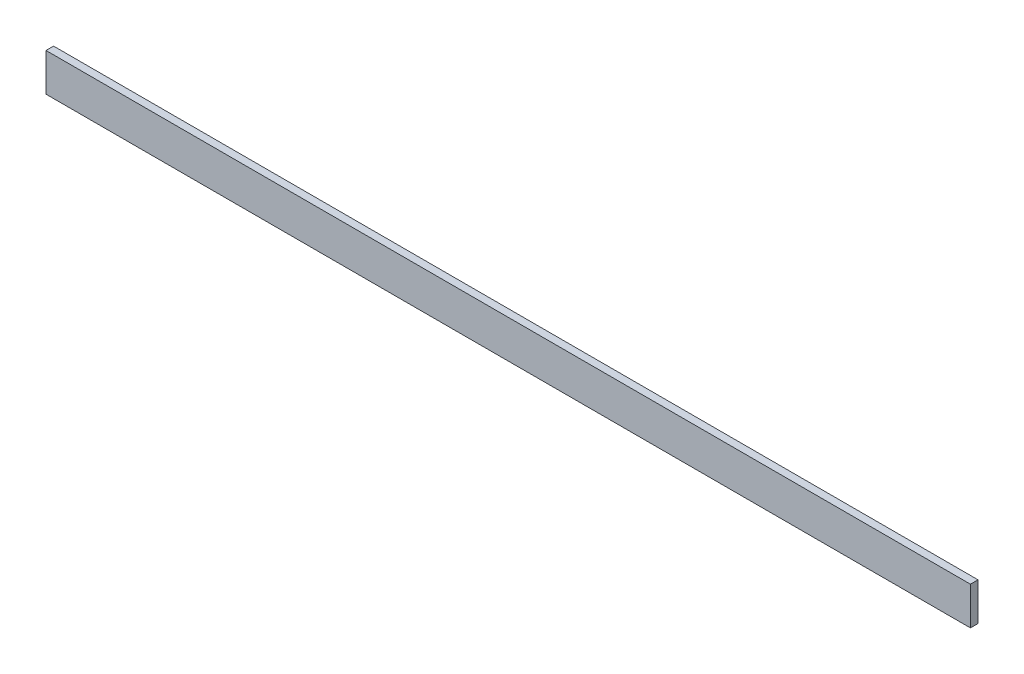
ISO-10303-21;
HEADER;
FILE_DESCRIPTION(('STEP AP214'),'2;1');
FILE_NAME('part.step','',(''),(''),'','','');
FILE_SCHEMA(('AUTOMOTIVE_DESIGN { 1 0 10303 214 1 1 1 1 }'));
ENDSEC;
DATA;
#1=APPLICATION_CONTEXT('core data for automotive mechanical design processes');
#2=APPLICATION_PROTOCOL_DEFINITION('international standard','automotive_design',2000,#1);
#3=PRODUCT_CONTEXT('',#1,'mechanical');
#4=PRODUCT('Part','Part','',(#3));
#5=PRODUCT_RELATED_PRODUCT_CATEGORY('part','',(#4));
#6=PRODUCT_DEFINITION_FORMATION('','',#4);
#7=PRODUCT_DEFINITION_CONTEXT('part definition',#1,'design');
#8=PRODUCT_DEFINITION('design','',#6,#7);
#9=PRODUCT_DEFINITION_SHAPE('','',#8);
#10=(LENGTH_UNIT() NAMED_UNIT(*) SI_UNIT(.MILLI.,.METRE.));
#11=(NAMED_UNIT(*) PLANE_ANGLE_UNIT() SI_UNIT($,.RADIAN.));
#12=(NAMED_UNIT(*) SI_UNIT($,.STERADIAN.) SOLID_ANGLE_UNIT());
#13=UNCERTAINTY_MEASURE_WITH_UNIT(LENGTH_MEASURE(1.E-05),#10,'distance_accuracy_value','');
#14=(GEOMETRIC_REPRESENTATION_CONTEXT(3) GLOBAL_UNCERTAINTY_ASSIGNED_CONTEXT((#13)) GLOBAL_UNIT_ASSIGNED_CONTEXT((#10,
#11,#12)) REPRESENTATION_CONTEXT('',''));
#15=CARTESIAN_POINT('',(0.,0.,0.));
#16=DIRECTION('',(0.,0.,1.));
#17=DIRECTION('',(1.,0.,0.));
#18=AXIS2_PLACEMENT_3D('',#15,#16,#17);
#19=CARTESIAN_POINT('',(-305.,12.5,5.));
#20=DIRECTION('',(1.,0.,0.));
#21=DIRECTION('',(0.,0.,-1.));
#22=AXIS2_PLACEMENT_3D('',#19,#20,#21);
#23=PLANE('',#22);
#24=DIRECTION('',(0.,-1.,0.));
#25=VECTOR('',#24,1.);
#26=CARTESIAN_POINT('',(-305.,12.5,0.));
#27=LINE('',#26,#25);
#28=CARTESIAN_POINT('',(-305.,12.5,0.));
#29=VERTEX_POINT('',#28);
#30=CARTESIAN_POINT('',(-305.,-12.5,0.));
#31=VERTEX_POINT('',#30);
#32=EDGE_CURVE('E96',#29,#31,#27,.T.);
#33=ORIENTED_EDGE('',*,*,#32,.T.);
#34=DIRECTION('',(0.,0.,-1.));
#35=VECTOR('',#34,1.);
#36=CARTESIAN_POINT('',(-305.,-12.5,5.));
#37=LINE('',#36,#35);
#38=CARTESIAN_POINT('',(-305.,-12.5,5.));
#39=VERTEX_POINT('',#38);
#40=EDGE_CURVE('E11',#39,#31,#37,.T.);
#41=ORIENTED_EDGE('',*,*,#40,.F.);
#42=DIRECTION('',(0.,-1.,0.));
#43=VECTOR('',#42,1.);
#44=CARTESIAN_POINT('',(-305.,12.5,5.));
#45=LINE('',#44,#43);
#46=CARTESIAN_POINT('',(-305.,12.5,5.));
#47=VERTEX_POINT('',#46);
#48=EDGE_CURVE('E84',#47,#39,#45,.T.);
#49=ORIENTED_EDGE('',*,*,#48,.F.);
#50=DIRECTION('',(0.,0.,-1.));
#51=VECTOR('',#50,1.);
#52=CARTESIAN_POINT('',(-305.,12.5,5.));
#53=LINE('',#52,#51);
#54=EDGE_CURVE('E92',#47,#29,#53,.T.);
#55=ORIENTED_EDGE('',*,*,#54,.T.);
#56=EDGE_LOOP('',(#33,#41,#49,#55));
#57=FACE_BOUND('',#56,.T.);
#58=ADVANCED_FACE('F33',(#57),#23,.F.);
#59=CARTESIAN_POINT('',(305.,-12.5,5.));
#60=DIRECTION('',(0.,1.,0.));
#61=DIRECTION('',(-1.,0.,0.));
#62=AXIS2_PLACEMENT_3D('',#59,#60,#61);
#63=PLANE('',#62);
#64=DIRECTION('',(1.,0.,0.));
#65=VECTOR('',#64,1.);
#66=CARTESIAN_POINT('',(305.,-12.5,0.));
#67=LINE('',#66,#65);
#68=CARTESIAN_POINT('',(305.,-12.5,0.));
#69=VERTEX_POINT('',#68);
#70=EDGE_CURVE('E88',#31,#69,#67,.T.);
#71=ORIENTED_EDGE('',*,*,#70,.T.);
#72=DIRECTION('',(0.,0.,-1.));
#73=VECTOR('',#72,1.);
#74=CARTESIAN_POINT('',(305.,-12.5,5.));
#75=LINE('',#74,#73);
#76=CARTESIAN_POINT('',(305.,-12.5,5.));
#77=VERTEX_POINT('',#76);
#78=EDGE_CURVE('E41',#77,#69,#75,.T.);
#79=ORIENTED_EDGE('',*,*,#78,.F.);
#80=DIRECTION('',(1.,0.,0.));
#81=VECTOR('',#80,1.);
#82=CARTESIAN_POINT('',(305.,-12.5,5.));
#83=LINE('',#82,#81);
#84=EDGE_CURVE('E79',#39,#77,#83,.T.);
#85=ORIENTED_EDGE('',*,*,#84,.F.);
#86=ORIENTED_EDGE('',*,*,#40,.T.);
#87=EDGE_LOOP('',(#71,#79,#85,#86));
#88=FACE_BOUND('',#87,.T.);
#89=ADVANCED_FACE('F87',(#88),#63,.F.);
#90=CARTESIAN_POINT('',(305.,12.5,5.));
#91=DIRECTION('',(-1.,0.,0.));
#92=DIRECTION('',(0.,0.,1.));
#93=AXIS2_PLACEMENT_3D('',#90,#91,#92);
#94=PLANE('',#93);
#95=DIRECTION('',(0.,1.,0.));
#96=VECTOR('',#95,1.);
#97=CARTESIAN_POINT('',(305.,12.5,0.));
#98=LINE('',#97,#96);
#99=CARTESIAN_POINT('',(305.,12.5,0.));
#100=VERTEX_POINT('',#99);
#101=EDGE_CURVE('E66',#69,#100,#98,.T.);
#102=ORIENTED_EDGE('',*,*,#101,.T.);
#103=DIRECTION('',(0.,0.,-1.));
#104=VECTOR('',#103,1.);
#105=CARTESIAN_POINT('',(305.,12.5,5.));
#106=LINE('',#105,#104);
#107=CARTESIAN_POINT('',(305.,12.5,5.));
#108=VERTEX_POINT('',#107);
#109=EDGE_CURVE('E89',#108,#100,#106,.T.);
#110=ORIENTED_EDGE('',*,*,#109,.F.);
#111=DIRECTION('',(0.,1.,0.));
#112=VECTOR('',#111,1.);
#113=CARTESIAN_POINT('',(305.,12.5,5.));
#114=LINE('',#113,#112);
#115=EDGE_CURVE('E82',#77,#108,#114,.T.);
#116=ORIENTED_EDGE('',*,*,#115,.F.);
#117=ORIENTED_EDGE('',*,*,#78,.T.);
#118=EDGE_LOOP('',(#102,#110,#116,#117));
#119=FACE_BOUND('',#118,.T.);
#120=ADVANCED_FACE('F90',(#119),#94,.F.);
#121=CARTESIAN_POINT('',(305.,12.5,5.));
#122=DIRECTION('',(0.,-1.,0.));
#123=DIRECTION('',(1.,0.,0.));
#124=AXIS2_PLACEMENT_3D('',#121,#122,#123);
#125=PLANE('',#124);
#126=DIRECTION('',(-1.,0.,0.));
#127=VECTOR('',#126,1.);
#128=CARTESIAN_POINT('',(305.,12.5,0.));
#129=LINE('',#128,#127);
#130=EDGE_CURVE('E72',#100,#29,#129,.T.);
#131=ORIENTED_EDGE('',*,*,#130,.T.);
#132=ORIENTED_EDGE('',*,*,#54,.F.);
#133=DIRECTION('',(-1.,0.,0.));
#134=VECTOR('',#133,1.);
#135=CARTESIAN_POINT('',(305.,12.5,5.));
#136=LINE('',#135,#134);
#137=EDGE_CURVE('E49',#108,#47,#136,.T.);
#138=ORIENTED_EDGE('',*,*,#137,.F.);
#139=ORIENTED_EDGE('',*,*,#109,.T.);
#140=EDGE_LOOP('',(#131,#132,#138,#139));
#141=FACE_BOUND('',#140,.T.);
#142=ADVANCED_FACE('F103',(#141),#125,.F.);
#143=CARTESIAN_POINT('',(0.,0.,5.));
#144=DIRECTION('',(0.,0.,-1.));
#145=DIRECTION('',(-1.,0.,0.));
#146=AXIS2_PLACEMENT_3D('',#143,#144,#145);
#147=PLANE('',#146);
#148=ORIENTED_EDGE('',*,*,#48,.T.);
#149=ORIENTED_EDGE('',*,*,#84,.T.);
#150=ORIENTED_EDGE('',*,*,#115,.T.);
#151=ORIENTED_EDGE('',*,*,#137,.T.);
#152=EDGE_LOOP('',(#148,#149,#150,#151));
#153=FACE_BOUND('',#152,.T.);
#154=ADVANCED_FACE('F80',(#153),#147,.F.);
#155=CARTESIAN_POINT('',(0.,0.,0.));
#156=DIRECTION('',(0.,0.,-1.));
#157=DIRECTION('',(-1.,0.,0.));
#158=AXIS2_PLACEMENT_3D('',#155,#156,#157);
#159=PLANE('',#158);
#160=ORIENTED_EDGE('',*,*,#32,.F.);
#161=ORIENTED_EDGE('',*,*,#130,.F.);
#162=ORIENTED_EDGE('',*,*,#101,.F.);
#163=ORIENTED_EDGE('',*,*,#70,.F.);
#164=EDGE_LOOP('',(#160,#161,#162,#163));
#165=FACE_BOUND('',#164,.T.);
#166=ADVANCED_FACE('F106',(#165),#159,.T.);
#167=CLOSED_SHELL('',(#58,#89,#120,#142,#154,#166));
#168=MANIFOLD_SOLID_BREP('B2',#167);
#169=ADVANCED_BREP_SHAPE_REPRESENTATION('',(#18,#168),#14);
#170=SHAPE_DEFINITION_REPRESENTATION(#9,#169);
ENDSEC;
END-ISO-10303-21;
